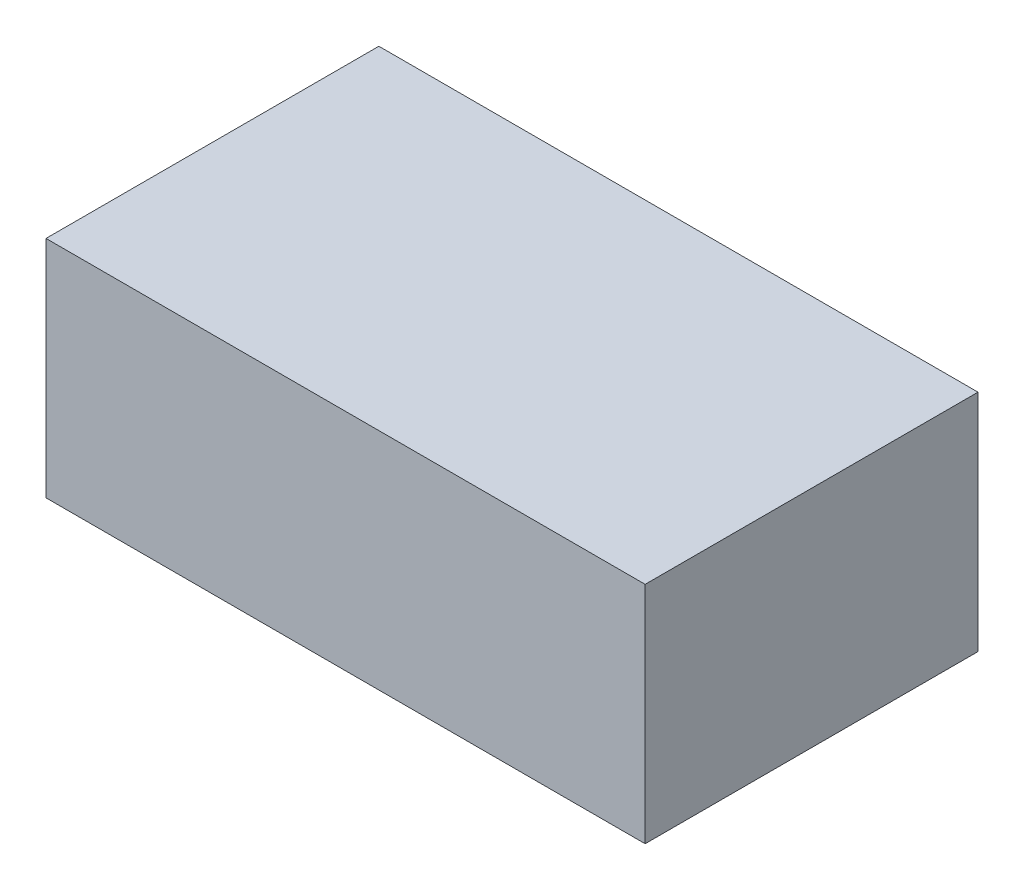
ISO-10303-21;
HEADER;
FILE_DESCRIPTION(('STEP AP214'),'2;1');
FILE_NAME('part.step','',(''),(''),'','','');
FILE_SCHEMA(('AUTOMOTIVE_DESIGN { 1 0 10303 214 1 1 1 1 }'));
ENDSEC;
DATA;
#1=APPLICATION_CONTEXT('core data for automotive mechanical design processes');
#2=APPLICATION_PROTOCOL_DEFINITION('international standard','automotive_design',2000,#1);
#3=PRODUCT_CONTEXT('',#1,'mechanical');
#4=PRODUCT('Part','Part','',(#3));
#5=PRODUCT_RELATED_PRODUCT_CATEGORY('part','',(#4));
#6=PRODUCT_DEFINITION_FORMATION('','',#4);
#7=PRODUCT_DEFINITION_CONTEXT('part definition',#1,'design');
#8=PRODUCT_DEFINITION('design','',#6,#7);
#9=PRODUCT_DEFINITION_SHAPE('','',#8);
#10=(LENGTH_UNIT() NAMED_UNIT(*) SI_UNIT(.MILLI.,.METRE.));
#11=(NAMED_UNIT(*) PLANE_ANGLE_UNIT() SI_UNIT($,.RADIAN.));
#12=(NAMED_UNIT(*) SI_UNIT($,.STERADIAN.) SOLID_ANGLE_UNIT());
#13=UNCERTAINTY_MEASURE_WITH_UNIT(LENGTH_MEASURE(1.E-05),#10,'distance_accuracy_value','');
#14=(GEOMETRIC_REPRESENTATION_CONTEXT(3) GLOBAL_UNCERTAINTY_ASSIGNED_CONTEXT((#13)) GLOBAL_UNIT_ASSIGNED_CONTEXT((#10,
#11,#12)) REPRESENTATION_CONTEXT('',''));
#15=CARTESIAN_POINT('',(0.,0.,0.));
#16=DIRECTION('',(0.,0.,1.));
#17=DIRECTION('',(1.,0.,0.));
#18=AXIS2_PLACEMENT_3D('',#15,#16,#17);
#19=CARTESIAN_POINT('',(21.6,0.,0.));
#20=DIRECTION('',(0.,-1.,0.));
#21=DIRECTION('',(0.,0.,-1.));
#22=AXIS2_PLACEMENT_3D('',#19,#20,#21);
#23=PLANE('',#22);
#24=DIRECTION('',(1.,0.,0.));
#25=VECTOR('',#24,1.);
#26=CARTESIAN_POINT('',(10.8,0.,0.));
#27=LINE('',#26,#25);
#28=CARTESIAN_POINT('',(0.,0.,0.));
#29=VERTEX_POINT('',#28);
#30=CARTESIAN_POINT('',(21.6,0.,0.));
#31=VERTEX_POINT('',#30);
#32=EDGE_CURVE('E68',#29,#31,#27,.T.);
#33=ORIENTED_EDGE('',*,*,#32,.T.);
#34=DIRECTION('',(0.,0.,-1.));
#35=VECTOR('',#34,1.);
#36=CARTESIAN_POINT('',(21.6,0.,0.));
#37=LINE('',#36,#35);
#38=CARTESIAN_POINT('',(21.6,0.,12.));
#39=VERTEX_POINT('',#38);
#40=EDGE_CURVE('E55',#39,#31,#37,.T.);
#41=ORIENTED_EDGE('',*,*,#40,.F.);
#42=DIRECTION('',(1.,0.,0.));
#43=VECTOR('',#42,1.);
#44=CARTESIAN_POINT('',(10.8,0.,12.));
#45=LINE('',#44,#43);
#46=CARTESIAN_POINT('',(0.,0.,12.));
#47=VERTEX_POINT('',#46);
#48=EDGE_CURVE('E20',#47,#39,#45,.T.);
#49=ORIENTED_EDGE('',*,*,#48,.F.);
#50=DIRECTION('',(0.,0.,1.));
#51=VECTOR('',#50,1.);
#52=CARTESIAN_POINT('',(0.,0.,0.));
#53=LINE('',#52,#51);
#54=EDGE_CURVE('E81',#29,#47,#53,.T.);
#55=ORIENTED_EDGE('',*,*,#54,.F.);
#56=EDGE_LOOP('',(#33,#41,#49,#55));
#57=FACE_BOUND('',#56,.T.);
#58=ADVANCED_FACE('F17',(#57),#23,.T.);
#59=CARTESIAN_POINT('',(10.8,4.05,12.));
#60=DIRECTION('',(0.,0.,1.));
#61=DIRECTION('',(1.,0.,0.));
#62=AXIS2_PLACEMENT_3D('',#59,#60,#61);
#63=PLANE('',#62);
#64=DIRECTION('',(0.,1.,0.));
#65=VECTOR('',#64,1.);
#66=CARTESIAN_POINT('',(21.6,8.1,12.));
#67=LINE('',#66,#65);
#68=CARTESIAN_POINT('',(21.6,8.1,12.));
#69=VERTEX_POINT('',#68);
#70=EDGE_CURVE('E61',#69,#39,#67,.F.);
#71=ORIENTED_EDGE('',*,*,#70,.F.);
#72=DIRECTION('',(1.,0.,0.));
#73=VECTOR('',#72,1.);
#74=CARTESIAN_POINT('',(0.,8.1,12.));
#75=LINE('',#74,#73);
#76=CARTESIAN_POINT('',(0.,8.1,12.));
#77=VERTEX_POINT('',#76);
#78=EDGE_CURVE('E83',#77,#69,#75,.T.);
#79=ORIENTED_EDGE('',*,*,#78,.F.);
#80=DIRECTION('',(0.,1.,0.));
#81=VECTOR('',#80,1.);
#82=CARTESIAN_POINT('',(0.,0.,12.));
#83=LINE('',#82,#81);
#84=EDGE_CURVE('E64',#47,#77,#83,.T.);
#85=ORIENTED_EDGE('',*,*,#84,.F.);
#86=ORIENTED_EDGE('',*,*,#48,.T.);
#87=EDGE_LOOP('',(#71,#79,#85,#86));
#88=FACE_BOUND('',#87,.T.);
#89=ADVANCED_FACE('F60',(#88),#63,.T.);
#90=CARTESIAN_POINT('',(21.6,8.1,0.));
#91=DIRECTION('',(1.,0.,0.));
#92=DIRECTION('',(0.,0.,-1.));
#93=AXIS2_PLACEMENT_3D('',#90,#91,#92);
#94=PLANE('',#93);
#95=DIRECTION('',(0.,1.,0.));
#96=VECTOR('',#95,1.);
#97=CARTESIAN_POINT('',(21.6,4.05,0.));
#98=LINE('',#97,#96);
#99=CARTESIAN_POINT('',(21.6,8.1,0.));
#100=VERTEX_POINT('',#99);
#101=EDGE_CURVE('E70',#31,#100,#98,.T.);
#102=ORIENTED_EDGE('',*,*,#101,.T.);
#103=DIRECTION('',(0.,0.,1.));
#104=VECTOR('',#103,1.);
#105=CARTESIAN_POINT('',(21.6,8.1,0.));
#106=LINE('',#105,#104);
#107=EDGE_CURVE('E74',#69,#100,#106,.F.);
#108=ORIENTED_EDGE('',*,*,#107,.F.);
#109=ORIENTED_EDGE('',*,*,#70,.T.);
#110=ORIENTED_EDGE('',*,*,#40,.T.);
#111=EDGE_LOOP('',(#102,#108,#109,#110));
#112=FACE_BOUND('',#111,.T.);
#113=ADVANCED_FACE('F72',(#112),#94,.T.);
#114=CARTESIAN_POINT('',(10.8,4.05,0.));
#115=DIRECTION('',(0.,0.,1.));
#116=DIRECTION('',(1.,0.,0.));
#117=AXIS2_PLACEMENT_3D('',#114,#115,#116);
#118=PLANE('',#117);
#119=DIRECTION('',(0.,1.,0.));
#120=VECTOR('',#119,1.);
#121=CARTESIAN_POINT('',(0.,0.,0.));
#122=LINE('',#121,#120);
#123=CARTESIAN_POINT('',(0.,8.1,0.));
#124=VERTEX_POINT('',#123);
#125=EDGE_CURVE('E35',#124,#29,#122,.F.);
#126=ORIENTED_EDGE('',*,*,#125,.F.);
#127=DIRECTION('',(1.,0.,0.));
#128=VECTOR('',#127,1.);
#129=CARTESIAN_POINT('',(0.,8.1,0.));
#130=LINE('',#129,#128);
#131=EDGE_CURVE('E26',#100,#124,#130,.F.);
#132=ORIENTED_EDGE('',*,*,#131,.F.);
#133=ORIENTED_EDGE('',*,*,#101,.F.);
#134=ORIENTED_EDGE('',*,*,#32,.F.);
#135=EDGE_LOOP('',(#126,#132,#133,#134));
#136=FACE_BOUND('',#135,.T.);
#137=ADVANCED_FACE('F89',(#136),#118,.F.);
#138=CARTESIAN_POINT('',(0.,0.,0.));
#139=DIRECTION('',(-1.,0.,0.));
#140=DIRECTION('',(0.,0.,1.));
#141=AXIS2_PLACEMENT_3D('',#138,#139,#140);
#142=PLANE('',#141);
#143=ORIENTED_EDGE('',*,*,#125,.T.);
#144=ORIENTED_EDGE('',*,*,#54,.T.);
#145=ORIENTED_EDGE('',*,*,#84,.T.);
#146=DIRECTION('',(0.,0.,1.));
#147=VECTOR('',#146,1.);
#148=CARTESIAN_POINT('',(0.,8.1,0.));
#149=LINE('',#148,#147);
#150=EDGE_CURVE('E11',#124,#77,#149,.T.);
#151=ORIENTED_EDGE('',*,*,#150,.F.);
#152=EDGE_LOOP('',(#143,#144,#145,#151));
#153=FACE_BOUND('',#152,.T.);
#154=ADVANCED_FACE('F91',(#153),#142,.T.);
#155=CARTESIAN_POINT('',(0.,8.1,0.));
#156=DIRECTION('',(0.,1.,0.));
#157=DIRECTION('',(0.,0.,1.));
#158=AXIS2_PLACEMENT_3D('',#155,#156,#157);
#159=PLANE('',#158);
#160=ORIENTED_EDGE('',*,*,#131,.T.);
#161=ORIENTED_EDGE('',*,*,#150,.T.);
#162=ORIENTED_EDGE('',*,*,#78,.T.);
#163=ORIENTED_EDGE('',*,*,#107,.T.);
#164=EDGE_LOOP('',(#160,#161,#162,#163));
#165=FACE_BOUND('',#164,.T.);
#166=ADVANCED_FACE('F88',(#165),#159,.T.);
#167=CLOSED_SHELL('',(#58,#89,#113,#137,#154,#166));
#168=MANIFOLD_SOLID_BREP('B1',#167);
#169=ADVANCED_BREP_SHAPE_REPRESENTATION('',(#18,#168),#14);
#170=SHAPE_DEFINITION_REPRESENTATION(#9,#169);
ENDSEC;
END-ISO-10303-21;
